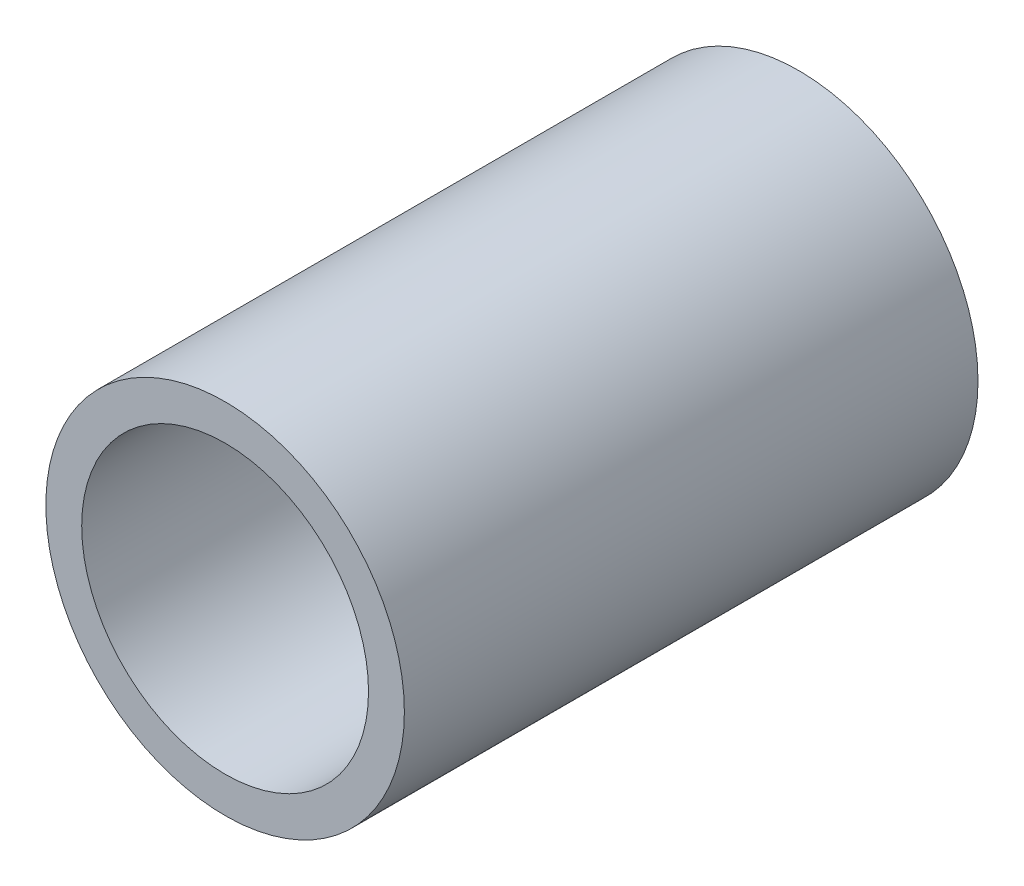
ISO-10303-21;
HEADER;
FILE_DESCRIPTION(('STEP AP214'),'2;1');
FILE_NAME('part.step','',(''),(''),'','','');
FILE_SCHEMA(('AUTOMOTIVE_DESIGN { 1 0 10303 214 1 1 1 1 }'));
ENDSEC;
DATA;
#1=APPLICATION_CONTEXT('core data for automotive mechanical design processes');
#2=APPLICATION_PROTOCOL_DEFINITION('international standard','automotive_design',2000,#1);
#3=PRODUCT_CONTEXT('',#1,'mechanical');
#4=PRODUCT('Part','Part','',(#3));
#5=PRODUCT_RELATED_PRODUCT_CATEGORY('part','',(#4));
#6=PRODUCT_DEFINITION_FORMATION('','',#4);
#7=PRODUCT_DEFINITION_CONTEXT('part definition',#1,'design');
#8=PRODUCT_DEFINITION('design','',#6,#7);
#9=PRODUCT_DEFINITION_SHAPE('','',#8);
#10=(LENGTH_UNIT() NAMED_UNIT(*) SI_UNIT(.MILLI.,.METRE.));
#11=(NAMED_UNIT(*) PLANE_ANGLE_UNIT() SI_UNIT($,.RADIAN.));
#12=(NAMED_UNIT(*) SI_UNIT($,.STERADIAN.) SOLID_ANGLE_UNIT());
#13=UNCERTAINTY_MEASURE_WITH_UNIT(LENGTH_MEASURE(1.E-05),#10,'distance_accuracy_value','');
#14=(GEOMETRIC_REPRESENTATION_CONTEXT(3) GLOBAL_UNCERTAINTY_ASSIGNED_CONTEXT((#13)) GLOBAL_UNIT_ASSIGNED_CONTEXT((#10,
#11,#12)) REPRESENTATION_CONTEXT('',''));
#15=CARTESIAN_POINT('',(0.,0.,0.));
#16=DIRECTION('',(0.,0.,1.));
#17=DIRECTION('',(1.,0.,0.));
#18=AXIS2_PLACEMENT_3D('',#15,#16,#17);
#19=CARTESIAN_POINT('',(0.,0.,12.));
#20=DIRECTION('',(0.,0.,1.));
#21=DIRECTION('',(1.,0.,0.));
#22=AXIS2_PLACEMENT_3D('',#19,#20,#21);
#23=PLANE('',#22);
#24=CARTESIAN_POINT('',(0.,0.,12.));
#25=DIRECTION('',(0.,0.,1.));
#26=DIRECTION('',(1.,0.,0.));
#27=AXIS2_PLACEMENT_3D('',#24,#25,#26);
#28=CIRCLE('',#27,7.5);
#29=CARTESIAN_POINT('',(7.5,0.,12.));
#30=VERTEX_POINT('',#29);
#31=EDGE_CURVE('E10',#30,#30,#28,.T.);
#32=ORIENTED_EDGE('',*,*,#31,.T.);
#33=EDGE_LOOP('',(#32));
#34=FACE_BOUND('',#33,.T.);
#35=CARTESIAN_POINT('',(0.,0.,12.));
#36=DIRECTION('',(0.,0.,1.));
#37=DIRECTION('',(1.,0.,0.));
#38=AXIS2_PLACEMENT_3D('',#35,#36,#37);
#39=CIRCLE('',#38,6.);
#40=CARTESIAN_POINT('',(6.,0.,12.));
#41=VERTEX_POINT('',#40);
#42=EDGE_CURVE('E48',#41,#41,#39,.T.);
#43=ORIENTED_EDGE('',*,*,#42,.F.);
#44=EDGE_LOOP('',(#43));
#45=FACE_BOUND('',#44,.T.);
#46=ADVANCED_FACE('F37',(#34,#45),#23,.T.);
#47=CARTESIAN_POINT('',(0.,0.,-12.));
#48=DIRECTION('',(0.,0.,1.));
#49=DIRECTION('',(1.,0.,0.));
#50=AXIS2_PLACEMENT_3D('',#47,#48,#49);
#51=PLANE('',#50);
#52=CARTESIAN_POINT('',(0.,0.,-12.));
#53=DIRECTION('',(0.,0.,1.));
#54=DIRECTION('',(1.,0.,0.));
#55=AXIS2_PLACEMENT_3D('',#52,#53,#54);
#56=CIRCLE('',#55,7.5);
#57=CARTESIAN_POINT('',(7.5,0.,-12.));
#58=VERTEX_POINT('',#57);
#59=EDGE_CURVE('E41',#58,#58,#56,.T.);
#60=ORIENTED_EDGE('',*,*,#59,.F.);
#61=EDGE_LOOP('',(#60));
#62=FACE_BOUND('',#61,.T.);
#63=CARTESIAN_POINT('',(0.,0.,-12.));
#64=DIRECTION('',(0.,0.,1.));
#65=DIRECTION('',(1.,0.,0.));
#66=AXIS2_PLACEMENT_3D('',#63,#64,#65);
#67=CIRCLE('',#66,6.);
#68=CARTESIAN_POINT('',(6.,0.,-12.));
#69=VERTEX_POINT('',#68);
#70=EDGE_CURVE('E50',#69,#69,#67,.T.);
#71=ORIENTED_EDGE('',*,*,#70,.T.);
#72=EDGE_LOOP('',(#71));
#73=FACE_BOUND('',#72,.T.);
#74=ADVANCED_FACE('F60',(#62,#73),#51,.F.);
#75=CARTESIAN_POINT('',(0.,0.,12.));
#76=DIRECTION('',(0.,0.,-1.));
#77=DIRECTION('',(-1.,0.,0.));
#78=AXIS2_PLACEMENT_3D('',#75,#76,#77);
#79=CYLINDRICAL_SURFACE('',#78,7.5);
#80=ORIENTED_EDGE('',*,*,#31,.F.);
#81=EDGE_LOOP('',(#80));
#82=FACE_BOUND('',#81,.T.);
#83=ORIENTED_EDGE('',*,*,#59,.T.);
#84=EDGE_LOOP('',(#83));
#85=FACE_BOUND('',#84,.T.);
#86=ADVANCED_FACE('F39',(#82,#85),#79,.T.);
#87=CARTESIAN_POINT('',(0.,0.,12.));
#88=DIRECTION('',(0.,0.,-1.));
#89=DIRECTION('',(-1.,0.,0.));
#90=AXIS2_PLACEMENT_3D('',#87,#88,#89);
#91=CYLINDRICAL_SURFACE('',#90,6.);
#92=ORIENTED_EDGE('',*,*,#42,.T.);
#93=EDGE_LOOP('',(#92));
#94=FACE_BOUND('',#93,.T.);
#95=ORIENTED_EDGE('',*,*,#70,.F.);
#96=EDGE_LOOP('',(#95));
#97=FACE_BOUND('',#96,.T.);
#98=ADVANCED_FACE('F56',(#94,#97),#91,.F.);
#99=CLOSED_SHELL('',(#46,#74,#86,#98));
#100=MANIFOLD_SOLID_BREP('B2',#99);
#101=ADVANCED_BREP_SHAPE_REPRESENTATION('',(#18,#100),#14);
#102=SHAPE_DEFINITION_REPRESENTATION(#9,#101);
ENDSEC;
END-ISO-10303-21;
